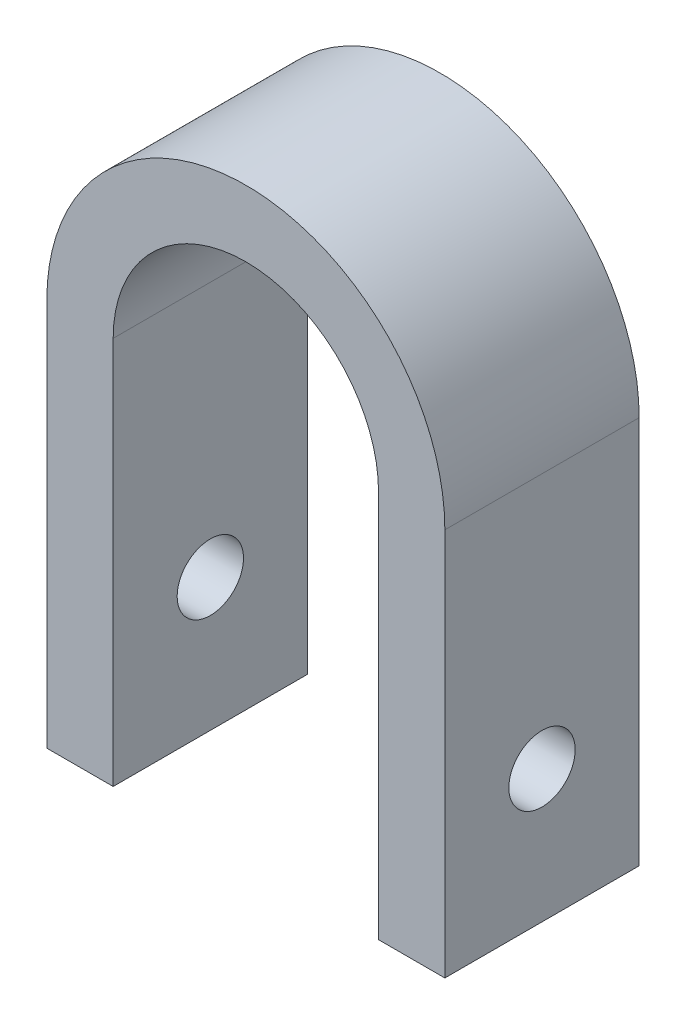
ISO-10303-21;
HEADER;
FILE_DESCRIPTION(('STEP AP214'),'2;1');
FILE_NAME('part.step','',(''),(''),'','','');
FILE_SCHEMA(('AUTOMOTIVE_DESIGN { 1 0 10303 214 1 1 1 1 }'));
ENDSEC;
DATA;
#1=APPLICATION_CONTEXT('core data for automotive mechanical design processes');
#2=APPLICATION_PROTOCOL_DEFINITION('international standard','automotive_design',2000,#1);
#3=PRODUCT_CONTEXT('',#1,'mechanical');
#4=PRODUCT('Part','Part','',(#3));
#5=PRODUCT_RELATED_PRODUCT_CATEGORY('part','',(#4));
#6=PRODUCT_DEFINITION_FORMATION('','',#4);
#7=PRODUCT_DEFINITION_CONTEXT('part definition',#1,'design');
#8=PRODUCT_DEFINITION('design','',#6,#7);
#9=PRODUCT_DEFINITION_SHAPE('','',#8);
#10=(LENGTH_UNIT() NAMED_UNIT(*) SI_UNIT(.MILLI.,.METRE.));
#11=(NAMED_UNIT(*) PLANE_ANGLE_UNIT() SI_UNIT($,.RADIAN.));
#12=(NAMED_UNIT(*) SI_UNIT($,.STERADIAN.) SOLID_ANGLE_UNIT());
#13=UNCERTAINTY_MEASURE_WITH_UNIT(LENGTH_MEASURE(1.E-05),#10,'distance_accuracy_value','');
#14=(GEOMETRIC_REPRESENTATION_CONTEXT(3) GLOBAL_UNCERTAINTY_ASSIGNED_CONTEXT((#13)) GLOBAL_UNIT_ASSIGNED_CONTEXT((#10,
#11,#12)) REPRESENTATION_CONTEXT('',''));
#15=CARTESIAN_POINT('',(0.,0.,0.));
#16=DIRECTION('',(0.,0.,1.));
#17=DIRECTION('',(1.,0.,0.));
#18=AXIS2_PLACEMENT_3D('',#15,#16,#17);
#19=CARTESIAN_POINT('',(0.,0.,5.85813493));
#20=DIRECTION('',(0.,0.,-1.));
#21=DIRECTION('',(-1.,0.,0.));
#22=AXIS2_PLACEMENT_3D('',#19,#20,#21);
#23=CYLINDRICAL_SURFACE('',#22,4.);
#24=CARTESIAN_POINT('',(0.,0.,0.));
#25=DIRECTION('',(0.,0.,-1.));
#26=DIRECTION('',(1.,0.,0.));
#27=AXIS2_PLACEMENT_3D('',#24,#25,#26);
#28=CIRCLE('',#27,4.);
#29=CARTESIAN_POINT('',(-4.,0.,0.));
#30=VERTEX_POINT('',#29);
#31=CARTESIAN_POINT('',(4.,0.,0.));
#32=VERTEX_POINT('',#31);
#33=EDGE_CURVE('E130',#30,#32,#28,.T.);
#34=ORIENTED_EDGE('',*,*,#33,.T.);
#35=DIRECTION('',(0.,0.,-1.));
#36=VECTOR('',#35,1.);
#37=CARTESIAN_POINT('',(4.,0.,5.85813493));
#38=LINE('',#37,#36);
#39=CARTESIAN_POINT('',(4.,0.,5.85813493));
#40=VERTEX_POINT('',#39);
#41=EDGE_CURVE('E11',#40,#32,#38,.T.);
#42=ORIENTED_EDGE('',*,*,#41,.F.);
#43=CARTESIAN_POINT('',(0.,0.,5.85813493));
#44=DIRECTION('',(0.,0.,-1.));
#45=DIRECTION('',(1.,0.,0.));
#46=AXIS2_PLACEMENT_3D('',#43,#44,#45);
#47=CIRCLE('',#46,4.);
#48=CARTESIAN_POINT('',(-4.,0.,5.85813493));
#49=VERTEX_POINT('',#48);
#50=EDGE_CURVE('E145',#49,#40,#47,.T.);
#51=ORIENTED_EDGE('',*,*,#50,.F.);
#52=DIRECTION('',(0.,0.,-1.));
#53=VECTOR('',#52,1.);
#54=CARTESIAN_POINT('',(-4.,0.,5.85813493));
#55=LINE('',#54,#53);
#56=EDGE_CURVE('E126',#49,#30,#55,.T.);
#57=ORIENTED_EDGE('',*,*,#56,.T.);
#58=EDGE_LOOP('',(#34,#42,#51,#57));
#59=FACE_BOUND('',#58,.T.);
#60=ADVANCED_FACE('F33',(#59),#23,.F.);
#61=CARTESIAN_POINT('',(4.,0.,5.85813493));
#62=DIRECTION('',(1.,-5.94859942086409E-11,0.));
#63=DIRECTION('',(5.94859942086409E-11,1.,0.));
#64=AXIS2_PLACEMENT_3D('',#61,#62,#63);
#65=PLANE('',#64);
#66=CARTESIAN_POINT('',(3.99999999954187,-7.7015254759383,2.929067465));
#67=DIRECTION('',(1.,-5.94859942086409E-11,0.));
#68=DIRECTION('',(5.94859942086409E-11,1.,0.));
#69=AXIS2_PLACEMENT_3D('',#66,#67,#68);
#70=CIRCLE('',#69,1.);
#71=CARTESIAN_POINT('',(3.99999999954187,-7.7015254759383,3.929067465));
#72=VERTEX_POINT('',#71);
#73=EDGE_CURVE('E134',#72,#72,#70,.T.);
#74=ORIENTED_EDGE('',*,*,#73,.T.);
#75=EDGE_LOOP('',(#74));
#76=FACE_BOUND('',#75,.T.);
#77=DIRECTION('',(-5.94859942086409E-11,-1.,0.));
#78=VECTOR('',#77,1.);
#79=CARTESIAN_POINT('',(4.,0.,0.));
#80=LINE('',#79,#78);
#81=CARTESIAN_POINT('',(3.99999999930393,-11.7015254759383,0.));
#82=VERTEX_POINT('',#81);
#83=EDGE_CURVE('E133',#32,#82,#80,.T.);
#84=ORIENTED_EDGE('',*,*,#83,.T.);
#85=DIRECTION('',(0.,0.,-1.));
#86=VECTOR('',#85,1.);
#87=CARTESIAN_POINT('',(3.99999999930393,-11.7015254759383,5.85813493));
#88=LINE('',#87,#86);
#89=CARTESIAN_POINT('',(3.99999999930393,-11.7015254759383,5.85813493));
#90=VERTEX_POINT('',#89);
#91=EDGE_CURVE('E42',#90,#82,#88,.T.);
#92=ORIENTED_EDGE('',*,*,#91,.F.);
#93=DIRECTION('',(-5.94859942086409E-11,-1.,0.));
#94=VECTOR('',#93,1.);
#95=CARTESIAN_POINT('',(4.,0.,5.85813493));
#96=LINE('',#95,#94);
#97=EDGE_CURVE('E93',#40,#90,#96,.T.);
#98=ORIENTED_EDGE('',*,*,#97,.F.);
#99=ORIENTED_EDGE('',*,*,#41,.T.);
#100=EDGE_LOOP('',(#84,#92,#98,#99));
#101=FACE_BOUND('',#100,.T.);
#102=ADVANCED_FACE('F206',(#76,#101),#65,.F.);
#103=CARTESIAN_POINT('',(6.,-11.7015254759383,5.85813493));
#104=DIRECTION('',(0.,1.,0.));
#105=DIRECTION('',(0.,0.,1.));
#106=AXIS2_PLACEMENT_3D('',#103,#104,#105);
#107=PLANE('',#106);
#108=DIRECTION('',(1.,0.,0.));
#109=VECTOR('',#108,1.);
#110=CARTESIAN_POINT('',(6.,-11.7015254759383,0.));
#111=LINE('',#110,#109);
#112=CARTESIAN_POINT('',(6.,-11.7015254759383,0.));
#113=VERTEX_POINT('',#112);
#114=EDGE_CURVE('E136',#82,#113,#111,.T.);
#115=ORIENTED_EDGE('',*,*,#114,.T.);
#116=DIRECTION('',(0.,0.,-1.));
#117=VECTOR('',#116,1.);
#118=CARTESIAN_POINT('',(6.,-11.7015254759383,5.85813493));
#119=LINE('',#118,#117);
#120=CARTESIAN_POINT('',(6.,-11.7015254759383,5.85813493));
#121=VERTEX_POINT('',#120);
#122=EDGE_CURVE('E152',#121,#113,#119,.T.);
#123=ORIENTED_EDGE('',*,*,#122,.F.);
#124=DIRECTION('',(1.,0.,0.));
#125=VECTOR('',#124,1.);
#126=CARTESIAN_POINT('',(6.,-11.7015254759383,5.85813493));
#127=LINE('',#126,#125);
#128=EDGE_CURVE('E161',#90,#121,#127,.T.);
#129=ORIENTED_EDGE('',*,*,#128,.F.);
#130=ORIENTED_EDGE('',*,*,#91,.T.);
#131=EDGE_LOOP('',(#115,#123,#129,#130));
#132=FACE_BOUND('',#131,.T.);
#133=ADVANCED_FACE('F159',(#132),#107,.F.);
#134=CARTESIAN_POINT('',(6.,0.,5.85813493));
#135=DIRECTION('',(-1.,0.,0.));
#136=DIRECTION('',(0.,0.,1.));
#137=AXIS2_PLACEMENT_3D('',#134,#135,#136);
#138=PLANE('',#137);
#139=CARTESIAN_POINT('',(6.,-7.7015254759383,2.929067465));
#140=DIRECTION('',(-1.,0.,0.));
#141=DIRECTION('',(0.,0.,1.));
#142=AXIS2_PLACEMENT_3D('',#139,#140,#141);
#143=CIRCLE('',#142,1.);
#144=CARTESIAN_POINT('',(6.,-7.7015254759383,3.929067465));
#145=VERTEX_POINT('',#144);
#146=EDGE_CURVE('E184',#145,#145,#143,.T.);
#147=ORIENTED_EDGE('',*,*,#146,.T.);
#148=EDGE_LOOP('',(#147));
#149=FACE_BOUND('',#148,.T.);
#150=DIRECTION('',(0.,1.,0.));
#151=VECTOR('',#150,1.);
#152=CARTESIAN_POINT('',(6.,0.,0.));
#153=LINE('',#152,#151);
#154=CARTESIAN_POINT('',(6.,0.,0.));
#155=VERTEX_POINT('',#154);
#156=EDGE_CURVE('E138',#113,#155,#153,.T.);
#157=ORIENTED_EDGE('',*,*,#156,.T.);
#158=DIRECTION('',(0.,0.,-1.));
#159=VECTOR('',#158,1.);
#160=CARTESIAN_POINT('',(6.,0.,5.85813493));
#161=LINE('',#160,#159);
#162=CARTESIAN_POINT('',(6.,0.,5.85813493));
#163=VERTEX_POINT('',#162);
#164=EDGE_CURVE('E149',#163,#155,#161,.T.);
#165=ORIENTED_EDGE('',*,*,#164,.F.);
#166=DIRECTION('',(0.,1.,0.));
#167=VECTOR('',#166,1.);
#168=CARTESIAN_POINT('',(6.,0.,5.85813493));
#169=LINE('',#168,#167);
#170=EDGE_CURVE('E173',#121,#163,#169,.T.);
#171=ORIENTED_EDGE('',*,*,#170,.F.);
#172=ORIENTED_EDGE('',*,*,#122,.T.);
#173=EDGE_LOOP('',(#157,#165,#171,#172));
#174=FACE_BOUND('',#173,.T.);
#175=ADVANCED_FACE('F169',(#149,#174),#138,.F.);
#176=CARTESIAN_POINT('',(0.,0.,5.85813493));
#177=DIRECTION('',(0.,0.,-1.));
#178=DIRECTION('',(-1.,0.,0.));
#179=AXIS2_PLACEMENT_3D('',#176,#177,#178);
#180=CYLINDRICAL_SURFACE('',#179,6.);
#181=CARTESIAN_POINT('',(0.,0.,0.));
#182=DIRECTION('',(0.,0.,1.));
#183=DIRECTION('',(1.,0.,0.));
#184=AXIS2_PLACEMENT_3D('',#181,#182,#183);
#185=CIRCLE('',#184,6.);
#186=CARTESIAN_POINT('',(-6.,0.,0.));
#187=VERTEX_POINT('',#186);
#188=EDGE_CURVE('E140',#155,#187,#185,.T.);
#189=ORIENTED_EDGE('',*,*,#188,.T.);
#190=DIRECTION('',(0.,0.,-1.));
#191=VECTOR('',#190,1.);
#192=CARTESIAN_POINT('',(-6.,0.,5.85813493));
#193=LINE('',#192,#191);
#194=CARTESIAN_POINT('',(-6.,0.,5.85813493));
#195=VERTEX_POINT('',#194);
#196=EDGE_CURVE('E121',#195,#187,#193,.T.);
#197=ORIENTED_EDGE('',*,*,#196,.F.);
#198=CARTESIAN_POINT('',(0.,0.,5.85813493));
#199=DIRECTION('',(0.,0.,1.));
#200=DIRECTION('',(1.,0.,0.));
#201=AXIS2_PLACEMENT_3D('',#198,#199,#200);
#202=CIRCLE('',#201,6.);
#203=EDGE_CURVE('E112',#163,#195,#202,.T.);
#204=ORIENTED_EDGE('',*,*,#203,.F.);
#205=ORIENTED_EDGE('',*,*,#164,.T.);
#206=EDGE_LOOP('',(#189,#197,#204,#205));
#207=FACE_BOUND('',#206,.T.);
#208=ADVANCED_FACE('F172',(#207),#180,.T.);
#209=CARTESIAN_POINT('',(-6.,0.,5.85813493));
#210=DIRECTION('',(1.,0.,0.));
#211=DIRECTION('',(0.,0.,-1.));
#212=AXIS2_PLACEMENT_3D('',#209,#210,#211);
#213=PLANE('',#212);
#214=CARTESIAN_POINT('',(-6.,-7.7015254759383,2.929067465));
#215=DIRECTION('',(-1.,0.,0.));
#216=DIRECTION('',(0.,0.,1.));
#217=AXIS2_PLACEMENT_3D('',#214,#215,#216);
#218=CIRCLE('',#217,1.);
#219=CARTESIAN_POINT('',(-6.,-7.7015254759383,3.929067465));
#220=VERTEX_POINT('',#219);
#221=EDGE_CURVE('E181',#220,#220,#218,.T.);
#222=ORIENTED_EDGE('',*,*,#221,.F.);
#223=EDGE_LOOP('',(#222));
#224=FACE_BOUND('',#223,.T.);
#225=DIRECTION('',(0.,-1.,0.));
#226=VECTOR('',#225,1.);
#227=CARTESIAN_POINT('',(-6.,0.,0.));
#228=LINE('',#227,#226);
#229=CARTESIAN_POINT('',(-6.,-11.7015254759383,0.));
#230=VERTEX_POINT('',#229);
#231=EDGE_CURVE('E120',#187,#230,#228,.T.);
#232=ORIENTED_EDGE('',*,*,#231,.T.);
#233=DIRECTION('',(0.,0.,-1.));
#234=VECTOR('',#233,1.);
#235=CARTESIAN_POINT('',(-6.,-11.7015254759383,5.85813493));
#236=LINE('',#235,#234);
#237=CARTESIAN_POINT('',(-6.,-11.7015254759383,5.85813493));
#238=VERTEX_POINT('',#237);
#239=EDGE_CURVE('E117',#238,#230,#236,.T.);
#240=ORIENTED_EDGE('',*,*,#239,.F.);
#241=DIRECTION('',(0.,-1.,0.));
#242=VECTOR('',#241,1.);
#243=CARTESIAN_POINT('',(-6.,0.,5.85813493));
#244=LINE('',#243,#242);
#245=EDGE_CURVE('E106',#195,#238,#244,.T.);
#246=ORIENTED_EDGE('',*,*,#245,.F.);
#247=ORIENTED_EDGE('',*,*,#196,.T.);
#248=EDGE_LOOP('',(#232,#240,#246,#247));
#249=FACE_BOUND('',#248,.T.);
#250=ADVANCED_FACE('F118',(#224,#249),#213,.F.);
#251=CARTESIAN_POINT('',(-6.,-11.7015254759383,5.85813493));
#252=DIRECTION('',(0.,1.,0.));
#253=DIRECTION('',(0.,0.,1.));
#254=AXIS2_PLACEMENT_3D('',#251,#252,#253);
#255=PLANE('',#254);
#256=DIRECTION('',(1.,0.,0.));
#257=VECTOR('',#256,1.);
#258=CARTESIAN_POINT('',(-6.,-11.7015254759383,0.));
#259=LINE('',#258,#257);
#260=CARTESIAN_POINT('',(-3.99999999999999,-11.7015254759383,0.));
#261=VERTEX_POINT('',#260);
#262=EDGE_CURVE('E79',#230,#261,#259,.T.);
#263=ORIENTED_EDGE('',*,*,#262,.T.);
#264=DIRECTION('',(0.,0.,-1.));
#265=VECTOR('',#264,1.);
#266=CARTESIAN_POINT('',(-3.99999999999999,-11.7015254759383,5.85813493));
#267=LINE('',#266,#265);
#268=CARTESIAN_POINT('',(-3.99999999999999,-11.7015254759383,5.85813493));
#269=VERTEX_POINT('',#268);
#270=EDGE_CURVE('E122',#269,#261,#267,.T.);
#271=ORIENTED_EDGE('',*,*,#270,.F.);
#272=DIRECTION('',(1.,0.,0.));
#273=VECTOR('',#272,1.);
#274=CARTESIAN_POINT('',(-6.,-11.7015254759383,5.85813493));
#275=LINE('',#274,#273);
#276=EDGE_CURVE('E110',#238,#269,#275,.T.);
#277=ORIENTED_EDGE('',*,*,#276,.F.);
#278=ORIENTED_EDGE('',*,*,#239,.T.);
#279=EDGE_LOOP('',(#263,#271,#277,#278));
#280=FACE_BOUND('',#279,.T.);
#281=ADVANCED_FACE('F124',(#280),#255,.F.);
#282=CARTESIAN_POINT('',(-4.,0.,5.85813493));
#283=DIRECTION('',(-1.,0.,0.));
#284=DIRECTION('',(0.,-1.,0.));
#285=AXIS2_PLACEMENT_3D('',#282,#283,#284);
#286=PLANE('',#285);
#287=CARTESIAN_POINT('',(-3.99999999999999,-7.7015254759383,2.929067465));
#288=DIRECTION('',(-1.,0.,0.));
#289=DIRECTION('',(0.,-1.,0.));
#290=AXIS2_PLACEMENT_3D('',#287,#288,#289);
#291=CIRCLE('',#290,1.);
#292=CARTESIAN_POINT('',(-3.99999999999999,-7.7015254759383,3.929067465));
#293=VERTEX_POINT('',#292);
#294=EDGE_CURVE('E36',#293,#293,#291,.T.);
#295=ORIENTED_EDGE('',*,*,#294,.T.);
#296=EDGE_LOOP('',(#295));
#297=FACE_BOUND('',#296,.T.);
#298=DIRECTION('',(0.,1.,0.));
#299=VECTOR('',#298,1.);
#300=CARTESIAN_POINT('',(-4.,0.,0.));
#301=LINE('',#300,#299);
#302=EDGE_CURVE('E85',#261,#30,#301,.T.);
#303=ORIENTED_EDGE('',*,*,#302,.T.);
#304=ORIENTED_EDGE('',*,*,#56,.F.);
#305=DIRECTION('',(0.,1.,0.));
#306=VECTOR('',#305,1.);
#307=CARTESIAN_POINT('',(-4.,0.,5.85813493));
#308=LINE('',#307,#306);
#309=EDGE_CURVE('E50',#269,#49,#308,.T.);
#310=ORIENTED_EDGE('',*,*,#309,.F.);
#311=ORIENTED_EDGE('',*,*,#270,.T.);
#312=EDGE_LOOP('',(#303,#304,#310,#311));
#313=FACE_BOUND('',#312,.T.);
#314=ADVANCED_FACE('F191',(#297,#313),#286,.F.);
#315=CARTESIAN_POINT('',(0.,0.,5.85813493));
#316=DIRECTION('',(0.,0.,1.));
#317=DIRECTION('',(1.,0.,0.));
#318=AXIS2_PLACEMENT_3D('',#315,#316,#317);
#319=PLANE('',#318);
#320=ORIENTED_EDGE('',*,*,#50,.T.);
#321=ORIENTED_EDGE('',*,*,#97,.T.);
#322=ORIENTED_EDGE('',*,*,#128,.T.);
#323=ORIENTED_EDGE('',*,*,#170,.T.);
#324=ORIENTED_EDGE('',*,*,#203,.T.);
#325=ORIENTED_EDGE('',*,*,#245,.T.);
#326=ORIENTED_EDGE('',*,*,#276,.T.);
#327=ORIENTED_EDGE('',*,*,#309,.T.);
#328=EDGE_LOOP('',(#320,#321,#322,#323,#324,#325,#326,#327));
#329=FACE_BOUND('',#328,.T.);
#330=ADVANCED_FACE('F108',(#329),#319,.T.);
#331=CARTESIAN_POINT('',(0.,0.,0.));
#332=DIRECTION('',(0.,0.,1.));
#333=DIRECTION('',(1.,0.,0.));
#334=AXIS2_PLACEMENT_3D('',#331,#332,#333);
#335=PLANE('',#334);
#336=ORIENTED_EDGE('',*,*,#33,.F.);
#337=ORIENTED_EDGE('',*,*,#302,.F.);
#338=ORIENTED_EDGE('',*,*,#262,.F.);
#339=ORIENTED_EDGE('',*,*,#231,.F.);
#340=ORIENTED_EDGE('',*,*,#188,.F.);
#341=ORIENTED_EDGE('',*,*,#156,.F.);
#342=ORIENTED_EDGE('',*,*,#114,.F.);
#343=ORIENTED_EDGE('',*,*,#83,.F.);
#344=EDGE_LOOP('',(#336,#337,#338,#339,#340,#341,#342,#343));
#345=FACE_BOUND('',#344,.T.);
#346=ADVANCED_FACE('F165',(#345),#335,.F.);
#347=CARTESIAN_POINT('',(6.,-7.7015254759383,2.929067465));
#348=DIRECTION('',(-1.,0.,0.));
#349=DIRECTION('',(0.,0.,1.));
#350=AXIS2_PLACEMENT_3D('',#347,#348,#349);
#351=CYLINDRICAL_SURFACE('',#350,1.);
#352=CARTESIAN_POINT('',(-6.,-7.7015254759383,3.929067465));
#353=CARTESIAN_POINT('',(-5.97916666666667,-7.7015254759383,3.929067465));
#354=CARTESIAN_POINT('',(-5.95833333333333,-7.7015254759383,3.929067465));
#355=CARTESIAN_POINT('',(-5.91666666666667,-7.7015254759383,3.929067465));
#356=CARTESIAN_POINT('',(-5.89583333333333,-7.7015254759383,3.929067465));
#357=CARTESIAN_POINT('',(-5.85416666666667,-7.7015254759383,3.929067465));
#358=CARTESIAN_POINT('',(-5.83333333333333,-7.7015254759383,3.929067465));
#359=CARTESIAN_POINT('',(-5.79166666666667,-7.7015254759383,3.929067465));
#360=CARTESIAN_POINT('',(-5.77083333333333,-7.7015254759383,3.929067465));
#361=CARTESIAN_POINT('',(-5.72916666666667,-7.7015254759383,3.929067465));
#362=CARTESIAN_POINT('',(-5.70833333333333,-7.7015254759383,3.929067465));
#363=CARTESIAN_POINT('',(-5.66666666666667,-7.7015254759383,3.929067465));
#364=CARTESIAN_POINT('',(-5.64583333333333,-7.7015254759383,3.929067465));
#365=CARTESIAN_POINT('',(-5.60416666666667,-7.7015254759383,3.929067465));
#366=CARTESIAN_POINT('',(-5.58333333333333,-7.7015254759383,3.929067465));
#367=CARTESIAN_POINT('',(-5.54166666666667,-7.7015254759383,3.929067465));
#368=CARTESIAN_POINT('',(-5.52083333333333,-7.7015254759383,3.929067465));
#369=CARTESIAN_POINT('',(-5.47916666666667,-7.7015254759383,3.929067465));
#370=CARTESIAN_POINT('',(-5.45833333333333,-7.7015254759383,3.929067465));
#371=CARTESIAN_POINT('',(-5.41666666666667,-7.7015254759383,3.929067465));
#372=CARTESIAN_POINT('',(-5.39583333333333,-7.7015254759383,3.929067465));
#373=CARTESIAN_POINT('',(-5.35416666666667,-7.7015254759383,3.929067465));
#374=CARTESIAN_POINT('',(-5.33333333333333,-7.7015254759383,3.929067465));
#375=CARTESIAN_POINT('',(-5.29166666666667,-7.7015254759383,3.929067465));
#376=CARTESIAN_POINT('',(-5.27083333333333,-7.7015254759383,3.929067465));
#377=CARTESIAN_POINT('',(-5.22916666666666,-7.7015254759383,3.929067465));
#378=CARTESIAN_POINT('',(-5.20833333333333,-7.7015254759383,3.929067465));
#379=CARTESIAN_POINT('',(-5.16666666666666,-7.7015254759383,3.929067465));
#380=CARTESIAN_POINT('',(-5.14583333333333,-7.7015254759383,3.929067465));
#381=CARTESIAN_POINT('',(-5.10416666666666,-7.7015254759383,3.929067465));
#382=CARTESIAN_POINT('',(-5.08333333333333,-7.7015254759383,3.929067465));
#383=CARTESIAN_POINT('',(-5.04166666666666,-7.7015254759383,3.929067465));
#384=CARTESIAN_POINT('',(-5.02083333333333,-7.7015254759383,3.929067465));
#385=CARTESIAN_POINT('',(-4.97916666666666,-7.7015254759383,3.929067465));
#386=CARTESIAN_POINT('',(-4.95833333333333,-7.7015254759383,3.929067465));
#387=CARTESIAN_POINT('',(-4.91666666666666,-7.7015254759383,3.929067465));
#388=CARTESIAN_POINT('',(-4.89583333333333,-7.7015254759383,3.929067465));
#389=CARTESIAN_POINT('',(-4.85416666666666,-7.7015254759383,3.929067465));
#390=CARTESIAN_POINT('',(-4.83333333333333,-7.7015254759383,3.929067465));
#391=CARTESIAN_POINT('',(-4.79166666666666,-7.7015254759383,3.929067465));
#392=CARTESIAN_POINT('',(-4.77083333333333,-7.7015254759383,3.929067465));
#393=CARTESIAN_POINT('',(-4.72916666666666,-7.7015254759383,3.929067465));
#394=CARTESIAN_POINT('',(-4.70833333333333,-7.7015254759383,3.929067465));
#395=CARTESIAN_POINT('',(-4.66666666666666,-7.7015254759383,3.929067465));
#396=CARTESIAN_POINT('',(-4.64583333333333,-7.7015254759383,3.929067465));
#397=CARTESIAN_POINT('',(-4.60416666666666,-7.7015254759383,3.929067465));
#398=CARTESIAN_POINT('',(-4.58333333333333,-7.7015254759383,3.929067465));
#399=CARTESIAN_POINT('',(-4.54166666666666,-7.7015254759383,3.929067465));
#400=CARTESIAN_POINT('',(-4.52083333333333,-7.7015254759383,3.929067465));
#401=CARTESIAN_POINT('',(-4.47916666666666,-7.7015254759383,3.929067465));
#402=CARTESIAN_POINT('',(-4.45833333333333,-7.7015254759383,3.929067465));
#403=CARTESIAN_POINT('',(-4.41666666666666,-7.7015254759383,3.929067465));
#404=CARTESIAN_POINT('',(-4.39583333333333,-7.7015254759383,3.929067465));
#405=CARTESIAN_POINT('',(-4.35416666666666,-7.7015254759383,3.929067465));
#406=CARTESIAN_POINT('',(-4.33333333333333,-7.7015254759383,3.929067465));
#407=CARTESIAN_POINT('',(-4.29166666666666,-7.7015254759383,3.929067465));
#408=CARTESIAN_POINT('',(-4.27083333333333,-7.7015254759383,3.929067465));
#409=CARTESIAN_POINT('',(-4.22916666666666,-7.7015254759383,3.929067465));
#410=CARTESIAN_POINT('',(-4.20833333333333,-7.7015254759383,3.929067465));
#411=CARTESIAN_POINT('',(-4.16666666666666,-7.7015254759383,3.929067465));
#412=CARTESIAN_POINT('',(-4.14583333333333,-7.7015254759383,3.929067465));
#413=CARTESIAN_POINT('',(-4.10416666666666,-7.7015254759383,3.929067465));
#414=CARTESIAN_POINT('',(-4.08333333333333,-7.7015254759383,3.929067465));
#415=CARTESIAN_POINT('',(-4.04166666666666,-7.7015254759383,3.929067465));
#416=CARTESIAN_POINT('',(-4.02083333333333,-7.7015254759383,3.929067465));
#417=CARTESIAN_POINT('',(-3.99999999999999,-7.7015254759383,3.929067465));
#418=B_SPLINE_CURVE_WITH_KNOTS('',3,(#352,#353,#354,#355,#356,#357,#358,#359,#360,#361,#362,
#363,#364,#365,#366,#367,#368,#369,#370,#371,#372,#373,#374,#375,#376,#377,#378,#379,#380,#381,
#382,#383,#384,#385,#386,#387,#388,#389,#390,#391,#392,#393,#394,#395,#396,#397,#398,#399,#400,
#401,#402,#403,#404,#405,#406,#407,#408,#409,#410,#411,#412,#413,#414,#415,#416,#417),
.UNSPECIFIED.,.F.,.F.,(4,2,2,2,2,2,2,2,2,2,2,2,2,2,2,2,2,2,2,2,2,2,2,2,2,2,2,2,2,2,2,2,4),(0.,
0.0625000000000001,0.125,0.1875,0.25,0.312500000000002,0.375000000000002,0.437500000000002,
0.500000000000002,0.562500000000002,0.625000000000002,0.687500000000002,0.750000000000004,
0.812500000000004,0.875000000000004,0.937500000000004,1.,1.0625,1.125,1.1875,1.25,
1.31250000000001,1.37500000000001,1.43750000000001,1.50000000000001,1.56250000000001,
1.62500000000001,1.68750000000001,1.75000000000001,1.81250000000001,1.87500000000001,
1.93750000000001,2.00000000000001),.UNSPECIFIED.);
#419=EDGE_CURVE('BSEAM193',#220,#293,#418,.T.);
#420=ORIENTED_EDGE('',*,*,#221,.T.);
#421=ORIENTED_EDGE('',*,*,#294,.F.);
#422=ORIENTED_EDGE('',*,*,#419,.T.);
#423=ORIENTED_EDGE('',*,*,#419,.F.);
#424=EDGE_LOOP('',(#420,#422,#421,#423));
#425=FACE_BOUND('',#424,.T.);
#426=ADVANCED_FACE('F193',(#425),#351,.F.);
#427=CARTESIAN_POINT('',(6.,-7.7015254759383,3.929067465));
#428=CARTESIAN_POINT('',(5.9791666666619,-7.7015254759383,3.929067465));
#429=CARTESIAN_POINT('',(5.95833333332379,-7.7015254759383,3.929067465));
#430=CARTESIAN_POINT('',(5.91666666664758,-7.7015254759383,3.929067465));
#431=CARTESIAN_POINT('',(5.89583333330947,-7.7015254759383,3.929067465));
#432=CARTESIAN_POINT('',(5.85416666663326,-7.7015254759383,3.929067465));
#433=CARTESIAN_POINT('',(5.83333333329516,-7.7015254759383,3.929067465));
#434=CARTESIAN_POINT('',(5.79166666661895,-7.7015254759383,3.929067465));
#435=CARTESIAN_POINT('',(5.77083333328084,-7.7015254759383,3.929067465));
#436=CARTESIAN_POINT('',(5.72916666660463,-7.7015254759383,3.929067465));
#437=CARTESIAN_POINT('',(5.70833333326652,-7.7015254759383,3.929067465));
#438=CARTESIAN_POINT('',(5.66666666659031,-7.7015254759383,3.929067465));
#439=CARTESIAN_POINT('',(5.64583333325221,-7.7015254759383,3.929067465));
#440=CARTESIAN_POINT('',(5.604166666576,-7.7015254759383,3.929067465));
#441=CARTESIAN_POINT('',(5.58333333323789,-7.7015254759383,3.929067465));
#442=CARTESIAN_POINT('',(5.54166666656168,-7.7015254759383,3.929067465));
#443=CARTESIAN_POINT('',(5.52083333322357,-7.7015254759383,3.929067465));
#444=CARTESIAN_POINT('',(5.47916666654736,-7.7015254759383,3.929067465));
#445=CARTESIAN_POINT('',(5.45833333320926,-7.7015254759383,3.929067465));
#446=CARTESIAN_POINT('',(5.41666666653305,-7.7015254759383,3.929067465));
#447=CARTESIAN_POINT('',(5.39583333319494,-7.7015254759383,3.929067465));
#448=CARTESIAN_POINT('',(5.35416666651873,-7.7015254759383,3.929067465));
#449=CARTESIAN_POINT('',(5.33333333318062,-7.7015254759383,3.929067465));
#450=CARTESIAN_POINT('',(5.29166666650441,-7.7015254759383,3.929067465));
#451=CARTESIAN_POINT('',(5.27083333316631,-7.7015254759383,3.929067465));
#452=CARTESIAN_POINT('',(5.2291666664901,-7.7015254759383,3.929067465));
#453=CARTESIAN_POINT('',(5.20833333315199,-7.7015254759383,3.929067465));
#454=CARTESIAN_POINT('',(5.16666666647578,-7.7015254759383,3.929067465));
#455=CARTESIAN_POINT('',(5.14583333313767,-7.7015254759383,3.929067465));
#456=CARTESIAN_POINT('',(5.10416666646146,-7.7015254759383,3.929067465));
#457=CARTESIAN_POINT('',(5.08333333312336,-7.7015254759383,3.929067465));
#458=CARTESIAN_POINT('',(5.04166666644715,-7.7015254759383,3.929067465));
#459=CARTESIAN_POINT('',(5.02083333310904,-7.7015254759383,3.929067465));
#460=CARTESIAN_POINT('',(4.97916666643283,-7.7015254759383,3.929067465));
#461=CARTESIAN_POINT('',(4.95833333309472,-7.7015254759383,3.929067465));
#462=CARTESIAN_POINT('',(4.91666666641851,-7.7015254759383,3.929067465));
#463=CARTESIAN_POINT('',(4.89583333308041,-7.7015254759383,3.929067465));
#464=CARTESIAN_POINT('',(4.8541666664042,-7.7015254759383,3.929067465));
#465=CARTESIAN_POINT('',(4.83333333306609,-7.7015254759383,3.929067465));
#466=CARTESIAN_POINT('',(4.79166666638988,-7.7015254759383,3.929067465));
#467=CARTESIAN_POINT('',(4.77083333305178,-7.7015254759383,3.929067465));
#468=CARTESIAN_POINT('',(4.72916666637556,-7.7015254759383,3.929067465));
#469=CARTESIAN_POINT('',(4.70833333303746,-7.7015254759383,3.929067465));
#470=CARTESIAN_POINT('',(4.66666666636125,-7.7015254759383,3.929067465));
#471=CARTESIAN_POINT('',(4.64583333302314,-7.7015254759383,3.929067465));
#472=CARTESIAN_POINT('',(4.60416666634693,-7.7015254759383,3.929067465));
#473=CARTESIAN_POINT('',(4.58333333300882,-7.7015254759383,3.929067465));
#474=CARTESIAN_POINT('',(4.54166666633261,-7.7015254759383,3.929067465));
#475=CARTESIAN_POINT('',(4.52083333299451,-7.7015254759383,3.929067465));
#476=CARTESIAN_POINT('',(4.4791666663183,-7.7015254759383,3.929067465));
#477=CARTESIAN_POINT('',(4.45833333298019,-7.7015254759383,3.929067465));
#478=CARTESIAN_POINT('',(4.41666666630398,-7.7015254759383,3.929067465));
#479=CARTESIAN_POINT('',(4.39583333296587,-7.7015254759383,3.929067465));
#480=CARTESIAN_POINT('',(4.35416666628966,-7.7015254759383,3.929067465));
#481=CARTESIAN_POINT('',(4.33333333295156,-7.7015254759383,3.929067465));
#482=CARTESIAN_POINT('',(4.29166666627535,-7.7015254759383,3.929067465));
#483=CARTESIAN_POINT('',(4.27083333293724,-7.7015254759383,3.929067465));
#484=CARTESIAN_POINT('',(4.22916666626103,-7.7015254759383,3.929067465));
#485=CARTESIAN_POINT('',(4.20833333292293,-7.7015254759383,3.929067465));
#486=CARTESIAN_POINT('',(4.16666666624671,-7.7015254759383,3.929067465));
#487=CARTESIAN_POINT('',(4.14583333290861,-7.7015254759383,3.929067465));
#488=CARTESIAN_POINT('',(4.1041666662324,-7.7015254759383,3.929067465));
#489=CARTESIAN_POINT('',(4.08333333289429,-7.7015254759383,3.929067465));
#490=CARTESIAN_POINT('',(4.04166666621808,-7.7015254759383,3.929067465));
#491=CARTESIAN_POINT('',(4.02083333287997,-7.7015254759383,3.929067465));
#492=CARTESIAN_POINT('',(3.99999999954187,-7.7015254759383,3.929067465));
#493=B_SPLINE_CURVE_WITH_KNOTS('',3,(#427,#428,#429,#430,#431,#432,#433,#434,#435,#436,#437,
#438,#439,#440,#441,#442,#443,#444,#445,#446,#447,#448,#449,#450,#451,#452,#453,#454,#455,#456,
#457,#458,#459,#460,#461,#462,#463,#464,#465,#466,#467,#468,#469,#470,#471,#472,#473,#474,#475,
#476,#477,#478,#479,#480,#481,#482,#483,#484,#485,#486,#487,#488,#489,#490,#491,#492),
.UNSPECIFIED.,.F.,.F.,(4,2,2,2,2,2,2,2,2,2,2,2,2,2,2,2,2,2,2,2,2,2,2,2,2,2,2,2,2,2,2,2,4),(0.,
0.0625000000143167,0.125000000028633,0.18750000004295,0.250000000057267,0.312500000071584,
0.3750000000859,0.437500000100217,0.500000000114534,0.56250000012885,0.625000000143166,
0.687500000157483,0.7500000001718,0.812500000186117,0.875000000200433,0.93750000021475,
1.00000000022907,1.06250000024338,1.1250000002577,1.18750000027202,1.25000000028633,
1.31250000030065,1.37500000031497,1.43750000032928,1.5000000003436,1.56250000035792,
1.62500000037223,1.68750000038655,1.75000000040087,1.81250000041518,1.8750000004295,
1.93750000044382,2.00000000045813),.UNSPECIFIED.);
#494=EDGE_CURVE('BSEAM195',#145,#72,#493,.T.);
#495=ORIENTED_EDGE('',*,*,#146,.F.);
#496=ORIENTED_EDGE('',*,*,#73,.F.);
#497=ORIENTED_EDGE('',*,*,#494,.T.);
#498=ORIENTED_EDGE('',*,*,#494,.F.);
#499=EDGE_LOOP('',(#495,#497,#496,#498));
#500=FACE_BOUND('',#499,.T.);
#501=ADVANCED_FACE('F195',(#500),#351,.F.);
#502=CLOSED_SHELL('',(#60,#102,#133,#175,#208,#250,#281,#314,#330,#346,#426,#501));
#503=MANIFOLD_SOLID_BREP('B2',#502);
#504=ADVANCED_BREP_SHAPE_REPRESENTATION('',(#18,#503),#14);
#505=SHAPE_DEFINITION_REPRESENTATION(#9,#504);
ENDSEC;
END-ISO-10303-21;
